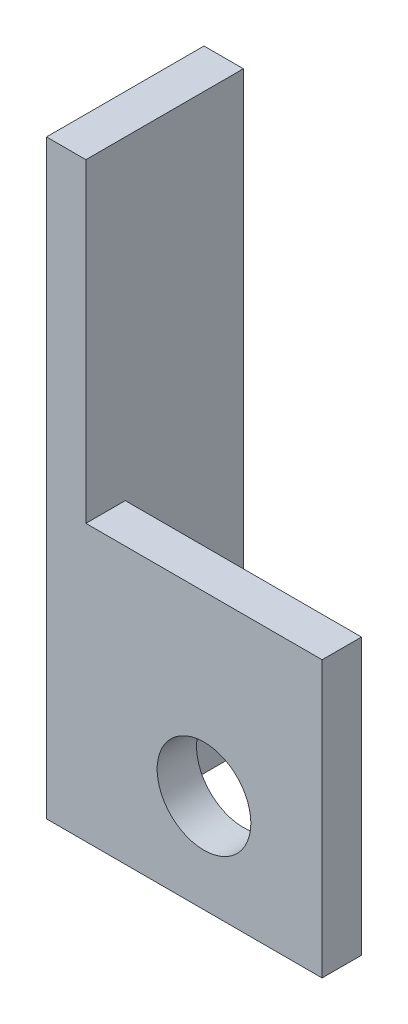
ISO-10303-21;
HEADER;
FILE_DESCRIPTION(('STEP AP214'),'2;1');
FILE_NAME('part.step','',(''),(''),'','','');
FILE_SCHEMA(('AUTOMOTIVE_DESIGN { 1 0 10303 214 1 1 1 1 }'));
ENDSEC;
DATA;
#1=APPLICATION_CONTEXT('core data for automotive mechanical design processes');
#2=APPLICATION_PROTOCOL_DEFINITION('international standard','automotive_design',2000,#1);
#3=PRODUCT_CONTEXT('',#1,'mechanical');
#4=PRODUCT('Part','Part','',(#3));
#5=PRODUCT_RELATED_PRODUCT_CATEGORY('part','',(#4));
#6=PRODUCT_DEFINITION_FORMATION('','',#4);
#7=PRODUCT_DEFINITION_CONTEXT('part definition',#1,'design');
#8=PRODUCT_DEFINITION('design','',#6,#7);
#9=PRODUCT_DEFINITION_SHAPE('','',#8);
#10=(LENGTH_UNIT() NAMED_UNIT(*) SI_UNIT(.MILLI.,.METRE.));
#11=(NAMED_UNIT(*) PLANE_ANGLE_UNIT() SI_UNIT($,.RADIAN.));
#12=(NAMED_UNIT(*) SI_UNIT($,.STERADIAN.) SOLID_ANGLE_UNIT());
#13=UNCERTAINTY_MEASURE_WITH_UNIT(LENGTH_MEASURE(1.E-05),#10,'distance_accuracy_value','');
#14=(GEOMETRIC_REPRESENTATION_CONTEXT(3) GLOBAL_UNCERTAINTY_ASSIGNED_CONTEXT((#13)) GLOBAL_UNIT_ASSIGNED_CONTEXT((#10,
#11,#12)) REPRESENTATION_CONTEXT('',''));
#15=CARTESIAN_POINT('',(0.,0.,0.));
#16=DIRECTION('',(0.,0.,1.));
#17=DIRECTION('',(1.,0.,0.));
#18=AXIS2_PLACEMENT_3D('',#15,#16,#17);
#19=CARTESIAN_POINT('',(0.,0.,0.));
#20=DIRECTION('',(0.,0.,1.));
#21=DIRECTION('',(1.,0.,0.));
#22=AXIS2_PLACEMENT_3D('',#19,#20,#21);
#23=PLANE('',#22);
#24=CARTESIAN_POINT('',(4.,2.5,0.));
#25=DIRECTION('',(0.,0.,1.));
#26=DIRECTION('',(1.,0.,0.));
#27=AXIS2_PLACEMENT_3D('',#24,#25,#26);
#28=CIRCLE('',#27,1.19007395916084);
#29=CARTESIAN_POINT('',(5.19007395916084,2.5,0.));
#30=VERTEX_POINT('',#29);
#31=EDGE_CURVE('E161',#30,#30,#28,.T.);
#32=ORIENTED_EDGE('',*,*,#31,.T.);
#33=EDGE_LOOP('',(#32));
#34=FACE_BOUND('',#33,.T.);
#35=DIRECTION('',(0.,-1.,0.));
#36=VECTOR('',#35,1.);
#37=CARTESIAN_POINT('',(1.,15.,0.));
#38=LINE('',#37,#36);
#39=CARTESIAN_POINT('',(1.,7.,0.));
#40=VERTEX_POINT('',#39);
#41=CARTESIAN_POINT('',(1.,0.,0.));
#42=VERTEX_POINT('',#41);
#43=EDGE_CURVE('E11',#40,#42,#38,.T.);
#44=ORIENTED_EDGE('',*,*,#43,.F.);
#45=DIRECTION('',(-1.,0.,0.));
#46=VECTOR('',#45,1.);
#47=CARTESIAN_POINT('',(7.,7.,0.));
#48=LINE('',#47,#46);
#49=CARTESIAN_POINT('',(7.,7.,0.));
#50=VERTEX_POINT('',#49);
#51=EDGE_CURVE('E123',#50,#40,#48,.T.);
#52=ORIENTED_EDGE('',*,*,#51,.F.);
#53=DIRECTION('',(0.,1.,0.));
#54=VECTOR('',#53,1.);
#55=CARTESIAN_POINT('',(7.,0.,0.));
#56=LINE('',#55,#54);
#57=CARTESIAN_POINT('',(7.,0.,0.));
#58=VERTEX_POINT('',#57);
#59=EDGE_CURVE('E120',#58,#50,#56,.T.);
#60=ORIENTED_EDGE('',*,*,#59,.F.);
#61=DIRECTION('',(1.,0.,0.));
#62=VECTOR('',#61,1.);
#63=CARTESIAN_POINT('',(0.,0.,0.));
#64=LINE('',#63,#62);
#65=EDGE_CURVE('E69',#42,#58,#64,.T.);
#66=ORIENTED_EDGE('',*,*,#65,.F.);
#67=EDGE_LOOP('',(#44,#52,#60,#66));
#68=FACE_BOUND('',#67,.T.);
#69=ADVANCED_FACE('F33',(#34,#68),#23,.F.);
#70=CARTESIAN_POINT('',(7.,0.,1.));
#71=DIRECTION('',(-1.,0.,0.));
#72=DIRECTION('',(0.,0.,1.));
#73=AXIS2_PLACEMENT_3D('',#70,#71,#72);
#74=PLANE('',#73);
#75=ORIENTED_EDGE('',*,*,#59,.T.);
#76=DIRECTION('',(0.,0.,-1.));
#77=VECTOR('',#76,1.);
#78=CARTESIAN_POINT('',(7.,7.,1.));
#79=LINE('',#78,#77);
#80=CARTESIAN_POINT('',(7.,7.,1.));
#81=VERTEX_POINT('',#80);
#82=EDGE_CURVE('E37',#81,#50,#79,.T.);
#83=ORIENTED_EDGE('',*,*,#82,.F.);
#84=DIRECTION('',(0.,1.,0.));
#85=VECTOR('',#84,1.);
#86=CARTESIAN_POINT('',(7.,0.,1.));
#87=LINE('',#86,#85);
#88=CARTESIAN_POINT('',(7.,0.,1.));
#89=VERTEX_POINT('',#88);
#90=EDGE_CURVE('E127',#89,#81,#87,.T.);
#91=ORIENTED_EDGE('',*,*,#90,.F.);
#92=DIRECTION('',(0.,0.,-1.));
#93=VECTOR('',#92,1.);
#94=CARTESIAN_POINT('',(7.,0.,1.));
#95=LINE('',#94,#93);
#96=EDGE_CURVE('E116',#89,#58,#95,.T.);
#97=ORIENTED_EDGE('',*,*,#96,.T.);
#98=EDGE_LOOP('',(#75,#83,#91,#97));
#99=FACE_BOUND('',#98,.T.);
#100=ADVANCED_FACE('F35',(#99),#74,.F.);
#101=CARTESIAN_POINT('',(7.,7.,1.));
#102=DIRECTION('',(0.,-1.,0.));
#103=DIRECTION('',(1.,0.,0.));
#104=AXIS2_PLACEMENT_3D('',#101,#102,#103);
#105=PLANE('',#104);
#106=ORIENTED_EDGE('',*,*,#51,.T.);
#107=DIRECTION('',(0.,0.,-1.));
#108=VECTOR('',#107,1.);
#109=CARTESIAN_POINT('',(1.,7.,1.));
#110=LINE('',#109,#108);
#111=CARTESIAN_POINT('',(1.,7.,1.));
#112=VERTEX_POINT('',#111);
#113=EDGE_CURVE('E130',#112,#40,#110,.T.);
#114=ORIENTED_EDGE('',*,*,#113,.F.);
#115=DIRECTION('',(-1.,0.,0.));
#116=VECTOR('',#115,1.);
#117=CARTESIAN_POINT('',(7.,7.,1.));
#118=LINE('',#117,#116);
#119=EDGE_CURVE('E78',#81,#112,#118,.T.);
#120=ORIENTED_EDGE('',*,*,#119,.F.);
#121=ORIENTED_EDGE('',*,*,#82,.T.);
#122=EDGE_LOOP('',(#106,#114,#120,#121));
#123=FACE_BOUND('',#122,.T.);
#124=ADVANCED_FACE('F134',(#123),#105,.F.);
#125=CARTESIAN_POINT('',(1.,7.,1.));
#126=DIRECTION('',(-1.,0.,0.));
#127=DIRECTION('',(0.,0.,1.));
#128=AXIS2_PLACEMENT_3D('',#125,#126,#127);
#129=PLANE('',#128);
#130=ORIENTED_EDGE('',*,*,#113,.T.);
#131=ORIENTED_EDGE('',*,*,#43,.T.);
#132=DIRECTION('',(0.,0.,1.));
#133=VECTOR('',#132,1.);
#134=CARTESIAN_POINT('',(1.,0.,-3.));
#135=LINE('',#134,#133);
#136=CARTESIAN_POINT('',(1.,0.,-3.));
#137=VERTEX_POINT('',#136);
#138=EDGE_CURVE('E124',#137,#42,#135,.T.);
#139=ORIENTED_EDGE('',*,*,#138,.F.);
#140=DIRECTION('',(0.,-1.,0.));
#141=VECTOR('',#140,1.);
#142=CARTESIAN_POINT('',(1.,15.,-3.));
#143=LINE('',#142,#141);
#144=CARTESIAN_POINT('',(1.,15.,-3.));
#145=VERTEX_POINT('',#144);
#146=EDGE_CURVE('E146',#145,#137,#143,.T.);
#147=ORIENTED_EDGE('',*,*,#146,.F.);
#148=DIRECTION('',(0.,0.,-1.));
#149=VECTOR('',#148,1.);
#150=CARTESIAN_POINT('',(1.,15.,1.));
#151=LINE('',#150,#149);
#152=CARTESIAN_POINT('',(1.,15.,1.));
#153=VERTEX_POINT('',#152);
#154=EDGE_CURVE('E110',#153,#145,#151,.T.);
#155=ORIENTED_EDGE('',*,*,#154,.F.);
#156=DIRECTION('',(0.,1.,0.));
#157=VECTOR('',#156,1.);
#158=CARTESIAN_POINT('',(1.,7.,1.));
#159=LINE('',#158,#157);
#160=EDGE_CURVE('E95',#112,#153,#159,.T.);
#161=ORIENTED_EDGE('',*,*,#160,.F.);
#162=EDGE_LOOP('',(#130,#131,#139,#147,#155,#161));
#163=FACE_BOUND('',#162,.T.);
#164=ADVANCED_FACE('F140',(#163),#129,.F.);
#165=CARTESIAN_POINT('',(1.,15.,1.));
#166=DIRECTION('',(0.,-1.,0.));
#167=DIRECTION('',(0.,0.,-1.));
#168=AXIS2_PLACEMENT_3D('',#165,#166,#167);
#169=PLANE('',#168);
#170=ORIENTED_EDGE('',*,*,#154,.T.);
#171=DIRECTION('',(1.,0.,0.));
#172=VECTOR('',#171,1.);
#173=CARTESIAN_POINT('',(0.,15.,-3.));
#174=LINE('',#173,#172);
#175=CARTESIAN_POINT('',(0.,15.,-3.));
#176=VERTEX_POINT('',#175);
#177=EDGE_CURVE('E106',#176,#145,#174,.T.);
#178=ORIENTED_EDGE('',*,*,#177,.F.);
#179=DIRECTION('',(0.,0.,-1.));
#180=VECTOR('',#179,1.);
#181=CARTESIAN_POINT('',(0.,15.,1.));
#182=LINE('',#181,#180);
#183=CARTESIAN_POINT('',(0.,15.,1.));
#184=VERTEX_POINT('',#183);
#185=EDGE_CURVE('E102',#184,#176,#182,.T.);
#186=ORIENTED_EDGE('',*,*,#185,.F.);
#187=DIRECTION('',(-1.,0.,0.));
#188=VECTOR('',#187,1.);
#189=CARTESIAN_POINT('',(1.,15.,1.));
#190=LINE('',#189,#188);
#191=EDGE_CURVE('E88',#153,#184,#190,.T.);
#192=ORIENTED_EDGE('',*,*,#191,.F.);
#193=EDGE_LOOP('',(#170,#178,#186,#192));
#194=FACE_BOUND('',#193,.T.);
#195=ADVANCED_FACE('F103',(#194),#169,.F.);
#196=CARTESIAN_POINT('',(0.,15.,1.));
#197=DIRECTION('',(1.,0.,0.));
#198=DIRECTION('',(0.,1.,0.));
#199=AXIS2_PLACEMENT_3D('',#196,#197,#198);
#200=PLANE('',#199);
#201=ORIENTED_EDGE('',*,*,#185,.T.);
#202=DIRECTION('',(0.,1.,0.));
#203=VECTOR('',#202,1.);
#204=CARTESIAN_POINT('',(0.,0.,-3.));
#205=LINE('',#204,#203);
#206=CARTESIAN_POINT('',(0.,0.,-3.));
#207=VERTEX_POINT('',#206);
#208=EDGE_CURVE('E156',#207,#176,#205,.T.);
#209=ORIENTED_EDGE('',*,*,#208,.F.);
#210=DIRECTION('',(0.,0.,-1.));
#211=VECTOR('',#210,1.);
#212=CARTESIAN_POINT('',(0.,0.,1.));
#213=LINE('',#212,#211);
#214=CARTESIAN_POINT('',(0.,0.,1.));
#215=VERTEX_POINT('',#214);
#216=EDGE_CURVE('E111',#215,#207,#213,.T.);
#217=ORIENTED_EDGE('',*,*,#216,.F.);
#218=DIRECTION('',(0.,-1.,0.));
#219=VECTOR('',#218,1.);
#220=CARTESIAN_POINT('',(0.,15.,1.));
#221=LINE('',#220,#219);
#222=EDGE_CURVE('E92',#184,#215,#221,.T.);
#223=ORIENTED_EDGE('',*,*,#222,.F.);
#224=EDGE_LOOP('',(#201,#209,#217,#223));
#225=FACE_BOUND('',#224,.T.);
#226=ADVANCED_FACE('F113',(#225),#200,.F.);
#227=CARTESIAN_POINT('',(0.,0.,1.));
#228=DIRECTION('',(0.,1.,0.));
#229=DIRECTION('',(0.,0.,1.));
#230=AXIS2_PLACEMENT_3D('',#227,#228,#229);
#231=PLANE('',#230);
#232=ORIENTED_EDGE('',*,*,#216,.T.);
#233=DIRECTION('',(-1.,0.,0.));
#234=VECTOR('',#233,1.);
#235=CARTESIAN_POINT('',(1.,0.,-3.));
#236=LINE('',#235,#234);
#237=EDGE_CURVE('E145',#137,#207,#236,.T.);
#238=ORIENTED_EDGE('',*,*,#237,.F.);
#239=ORIENTED_EDGE('',*,*,#138,.T.);
#240=ORIENTED_EDGE('',*,*,#65,.T.);
#241=ORIENTED_EDGE('',*,*,#96,.F.);
#242=DIRECTION('',(1.,0.,0.));
#243=VECTOR('',#242,1.);
#244=CARTESIAN_POINT('',(0.,0.,1.));
#245=LINE('',#244,#243);
#246=EDGE_CURVE('E51',#215,#89,#245,.T.);
#247=ORIENTED_EDGE('',*,*,#246,.F.);
#248=EDGE_LOOP('',(#232,#238,#239,#240,#241,#247));
#249=FACE_BOUND('',#248,.T.);
#250=ADVANCED_FACE('F143',(#249),#231,.F.);
#251=CARTESIAN_POINT('',(0.,0.,1.));
#252=DIRECTION('',(0.,0.,1.));
#253=DIRECTION('',(1.,0.,0.));
#254=AXIS2_PLACEMENT_3D('',#251,#252,#253);
#255=PLANE('',#254);
#256=CARTESIAN_POINT('',(4.,2.5,1.));
#257=DIRECTION('',(0.,0.,1.));
#258=DIRECTION('',(1.,0.,0.));
#259=AXIS2_PLACEMENT_3D('',#256,#257,#258);
#260=CIRCLE('',#259,1.19007395916084);
#261=CARTESIAN_POINT('',(5.19007395916084,2.5,1.));
#262=VERTEX_POINT('',#261);
#263=EDGE_CURVE('E164',#262,#262,#260,.T.);
#264=ORIENTED_EDGE('',*,*,#263,.F.);
#265=EDGE_LOOP('',(#264));
#266=FACE_BOUND('',#265,.T.);
#267=ORIENTED_EDGE('',*,*,#90,.T.);
#268=ORIENTED_EDGE('',*,*,#119,.T.);
#269=ORIENTED_EDGE('',*,*,#160,.T.);
#270=ORIENTED_EDGE('',*,*,#191,.T.);
#271=ORIENTED_EDGE('',*,*,#222,.T.);
#272=ORIENTED_EDGE('',*,*,#246,.T.);
#273=EDGE_LOOP('',(#267,#268,#269,#270,#271,#272));
#274=FACE_BOUND('',#273,.T.);
#275=ADVANCED_FACE('F90',(#266,#274),#255,.T.);
#276=CARTESIAN_POINT('',(0.,0.,-3.));
#277=DIRECTION('',(0.,0.,-1.));
#278=DIRECTION('',(-1.,0.,0.));
#279=AXIS2_PLACEMENT_3D('',#276,#277,#278);
#280=PLANE('',#279);
#281=ORIENTED_EDGE('',*,*,#237,.T.);
#282=ORIENTED_EDGE('',*,*,#208,.T.);
#283=ORIENTED_EDGE('',*,*,#177,.T.);
#284=ORIENTED_EDGE('',*,*,#146,.T.);
#285=EDGE_LOOP('',(#281,#282,#283,#284));
#286=FACE_BOUND('',#285,.T.);
#287=ADVANCED_FACE('F155',(#286),#280,.T.);
#288=CARTESIAN_POINT('',(4.,2.5,-2.));
#289=DIRECTION('',(0.,0.,1.));
#290=DIRECTION('',(1.,0.,0.));
#291=AXIS2_PLACEMENT_3D('',#288,#289,#290);
#292=CYLINDRICAL_SURFACE('',#291,1.19007395916084);
#293=ORIENTED_EDGE('',*,*,#263,.T.);
#294=EDGE_LOOP('',(#293));
#295=FACE_BOUND('',#294,.T.);
#296=ORIENTED_EDGE('',*,*,#31,.F.);
#297=EDGE_LOOP('',(#296));
#298=FACE_BOUND('',#297,.T.);
#299=ADVANCED_FACE('F168',(#295,#298),#292,.F.);
#300=CLOSED_SHELL('',(#69,#100,#124,#164,#195,#226,#250,#275,#287,#299));
#301=MANIFOLD_SOLID_BREP('B2',#300);
#302=ADVANCED_BREP_SHAPE_REPRESENTATION('',(#18,#301),#14);
#303=SHAPE_DEFINITION_REPRESENTATION(#9,#302);
ENDSEC;
END-ISO-10303-21;
